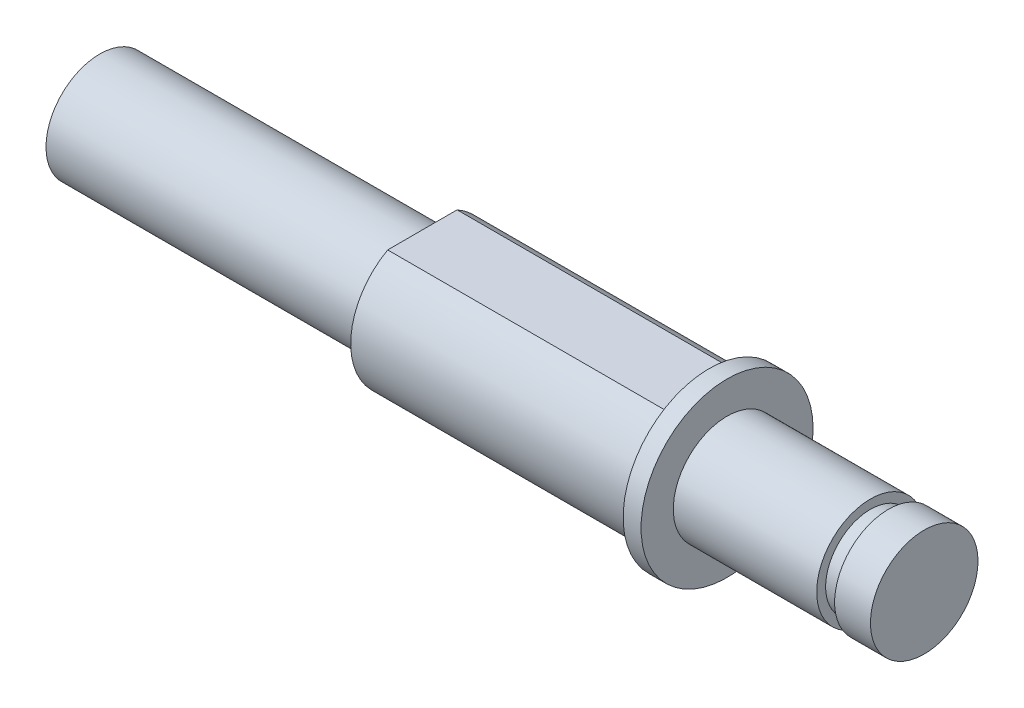
ISO-10303-21;
HEADER;
FILE_DESCRIPTION(('STEP AP214'),'2;1');
FILE_NAME('part.step','',(''),(''),'','','');
FILE_SCHEMA(('AUTOMOTIVE_DESIGN { 1 0 10303 214 1 1 1 1 }'));
ENDSEC;
DATA;
#1=APPLICATION_CONTEXT('core data for automotive mechanical design processes');
#2=APPLICATION_PROTOCOL_DEFINITION('international standard','automotive_design',2000,#1);
#3=PRODUCT_CONTEXT('',#1,'mechanical');
#4=PRODUCT('Part','Part','',(#3));
#5=PRODUCT_RELATED_PRODUCT_CATEGORY('part','',(#4));
#6=PRODUCT_DEFINITION_FORMATION('','',#4);
#7=PRODUCT_DEFINITION_CONTEXT('part definition',#1,'design');
#8=PRODUCT_DEFINITION('design','',#6,#7);
#9=PRODUCT_DEFINITION_SHAPE('','',#8);
#10=(LENGTH_UNIT() NAMED_UNIT(*) SI_UNIT(.MILLI.,.METRE.));
#11=(NAMED_UNIT(*) PLANE_ANGLE_UNIT() SI_UNIT($,.RADIAN.));
#12=(NAMED_UNIT(*) SI_UNIT($,.STERADIAN.) SOLID_ANGLE_UNIT());
#13=UNCERTAINTY_MEASURE_WITH_UNIT(LENGTH_MEASURE(1.E-05),#10,'distance_accuracy_value','');
#14=(GEOMETRIC_REPRESENTATION_CONTEXT(3) GLOBAL_UNCERTAINTY_ASSIGNED_CONTEXT((#13)) GLOBAL_UNIT_ASSIGNED_CONTEXT((#10,
#11,#12)) REPRESENTATION_CONTEXT('',''));
#15=CARTESIAN_POINT('',(0.,0.,0.));
#16=DIRECTION('',(0.,0.,1.));
#17=DIRECTION('',(1.,0.,0.));
#18=AXIS2_PLACEMENT_3D('',#15,#16,#17);
#19=CARTESIAN_POINT('',(23.,0.,0.));
#20=DIRECTION('',(-1.,0.,0.));
#21=DIRECTION('',(0.,0.,1.));
#22=AXIS2_PLACEMENT_3D('',#19,#20,#21);
#23=CYLINDRICAL_SURFACE('',#22,1.5);
#24=CARTESIAN_POINT('',(17.5,0.,0.));
#25=DIRECTION('',(1.,0.,0.));
#26=DIRECTION('',(0.,0.,-1.));
#27=AXIS2_PLACEMENT_3D('',#24,#25,#26);
#28=CIRCLE('',#27,1.5);
#29=CARTESIAN_POINT('',(17.5,0.,-1.5));
#30=VERTEX_POINT('',#29);
#31=EDGE_CURVE('E128',#30,#30,#28,.T.);
#32=ORIENTED_EDGE('',*,*,#31,.T.);
#33=EDGE_LOOP('',(#32));
#34=FACE_BOUND('',#33,.T.);
#35=CARTESIAN_POINT('',(21.5,0.,0.));
#36=DIRECTION('',(1.,0.,0.));
#37=DIRECTION('',(0.,0.,-1.));
#38=AXIS2_PLACEMENT_3D('',#35,#36,#37);
#39=CIRCLE('',#38,1.5);
#40=CARTESIAN_POINT('',(21.5,0.,-1.5));
#41=VERTEX_POINT('',#40);
#42=EDGE_CURVE('E124',#41,#41,#39,.T.);
#43=ORIENTED_EDGE('',*,*,#42,.F.);
#44=EDGE_LOOP('',(#43));
#45=FACE_BOUND('',#44,.T.);
#46=ADVANCED_FACE('F37',(#34,#45),#23,.T.);
#47=CARTESIAN_POINT('',(17.,0.,0.));
#48=DIRECTION('',(-1.,0.,0.));
#49=DIRECTION('',(0.,0.,1.));
#50=AXIS2_PLACEMENT_3D('',#47,#48,#49);
#51=CYLINDRICAL_SURFACE('',#50,2.);
#52=CARTESIAN_POINT('',(9.,0.,0.));
#53=DIRECTION('',(-1.,0.,0.));
#54=DIRECTION('',(0.,0.,1.));
#55=AXIS2_PLACEMENT_3D('',#52,#53,#54);
#56=CIRCLE('',#55,2.);
#57=CARTESIAN_POINT('',(9.,1.75,-0.968245836551854));
#58=VERTEX_POINT('',#57);
#59=CARTESIAN_POINT('',(9.,1.75,0.968245836551854));
#60=VERTEX_POINT('',#59);
#61=EDGE_CURVE('E78',#58,#60,#56,.T.);
#62=ORIENTED_EDGE('',*,*,#61,.F.);
#63=DIRECTION('',(-1.,0.,0.));
#64=VECTOR('',#63,1.);
#65=CARTESIAN_POINT('',(17.,1.75,-0.968245836551854));
#66=LINE('',#65,#64);
#67=CARTESIAN_POINT('',(17.,1.75,-0.968245836551854));
#68=VERTEX_POINT('',#67);
#69=EDGE_CURVE('E74',#68,#58,#66,.T.);
#70=ORIENTED_EDGE('',*,*,#69,.F.);
#71=CARTESIAN_POINT('',(17.,0.,0.));
#72=DIRECTION('',(-1.,0.,0.));
#73=DIRECTION('',(0.,0.,1.));
#74=AXIS2_PLACEMENT_3D('',#71,#72,#73);
#75=CIRCLE('',#74,2.);
#76=CARTESIAN_POINT('',(17.,1.75,0.968245836551854));
#77=VERTEX_POINT('',#76);
#78=EDGE_CURVE('E52',#68,#77,#75,.T.);
#79=ORIENTED_EDGE('',*,*,#78,.T.);
#80=DIRECTION('',(-1.,0.,0.));
#81=VECTOR('',#80,1.);
#82=CARTESIAN_POINT('',(17.,1.75,0.968245836551854));
#83=LINE('',#82,#81);
#84=EDGE_CURVE('E62',#77,#60,#83,.T.);
#85=ORIENTED_EDGE('',*,*,#84,.T.);
#86=EDGE_LOOP('',(#62,#70,#79,#85));
#87=FACE_BOUND('',#86,.T.);
#88=ADVANCED_FACE('F76',(#87),#51,.T.);
#89=CARTESIAN_POINT('',(17.,1.75,0.968245836551854));
#90=DIRECTION('',(0.,1.,0.));
#91=DIRECTION('',(0.,0.,1.));
#92=AXIS2_PLACEMENT_3D('',#89,#90,#91);
#93=PLANE('',#92);
#94=DIRECTION('',(0.,0.,-1.));
#95=VECTOR('',#94,1.);
#96=CARTESIAN_POINT('',(9.,1.75,0.968245836551854));
#97=LINE('',#96,#95);
#98=EDGE_CURVE('E73',#60,#58,#97,.T.);
#99=ORIENTED_EDGE('',*,*,#98,.F.);
#100=ORIENTED_EDGE('',*,*,#84,.F.);
#101=DIRECTION('',(0.,0.,-1.));
#102=VECTOR('',#101,1.);
#103=CARTESIAN_POINT('',(17.,1.75,0.968245836551854));
#104=LINE('',#103,#102);
#105=EDGE_CURVE('E65',#77,#68,#104,.T.);
#106=ORIENTED_EDGE('',*,*,#105,.T.);
#107=ORIENTED_EDGE('',*,*,#69,.T.);
#108=EDGE_LOOP('',(#99,#100,#106,#107));
#109=FACE_BOUND('',#108,.T.);
#110=ADVANCED_FACE('F71',(#109),#93,.T.);
#111=CARTESIAN_POINT('',(9.,0.,0.));
#112=DIRECTION('',(-1.,0.,0.));
#113=DIRECTION('',(0.,0.,1.));
#114=AXIS2_PLACEMENT_3D('',#111,#112,#113);
#115=PLANE('',#114);
#116=CARTESIAN_POINT('',(9.,0.,0.));
#117=DIRECTION('',(-1.,0.,0.));
#118=DIRECTION('',(0.,0.,1.));
#119=AXIS2_PLACEMENT_3D('',#116,#117,#118);
#120=CIRCLE('',#119,1.5);
#121=CARTESIAN_POINT('',(9.,0.,1.5));
#122=VERTEX_POINT('',#121);
#123=EDGE_CURVE('E81',#122,#122,#120,.T.);
#124=ORIENTED_EDGE('',*,*,#123,.F.);
#125=EDGE_LOOP('',(#124));
#126=FACE_BOUND('',#125,.T.);
#127=ORIENTED_EDGE('',*,*,#61,.T.);
#128=ORIENTED_EDGE('',*,*,#98,.T.);
#129=EDGE_LOOP('',(#127,#128));
#130=FACE_BOUND('',#129,.T.);
#131=ADVANCED_FACE('F91',(#126,#130),#115,.T.);
#132=CARTESIAN_POINT('',(0.,0.,0.));
#133=DIRECTION('',(1.,0.,0.));
#134=DIRECTION('',(0.,0.,-1.));
#135=AXIS2_PLACEMENT_3D('',#132,#133,#134);
#136=PLANE('',#135);
#137=CARTESIAN_POINT('',(0.,0.,0.));
#138=DIRECTION('',(1.,0.,0.));
#139=DIRECTION('',(0.,0.,-1.));
#140=AXIS2_PLACEMENT_3D('',#137,#138,#139);
#141=CIRCLE('',#140,1.5);
#142=CARTESIAN_POINT('',(0.,0.,-1.5));
#143=VERTEX_POINT('',#142);
#144=EDGE_CURVE('E41',#143,#143,#141,.T.);
#145=ORIENTED_EDGE('',*,*,#144,.F.);
#146=EDGE_LOOP('',(#145));
#147=FACE_BOUND('',#146,.T.);
#148=ADVANCED_FACE('F89',(#147),#136,.F.);
#149=ORIENTED_EDGE('',*,*,#123,.T.);
#150=EDGE_LOOP('',(#149));
#151=FACE_BOUND('',#150,.T.);
#152=ORIENTED_EDGE('',*,*,#144,.T.);
#153=EDGE_LOOP('',(#152));
#154=FACE_BOUND('',#153,.T.);
#155=ADVANCED_FACE('F39',(#151,#154),#23,.T.);
#156=CARTESIAN_POINT('',(17.5,0.,0.));
#157=DIRECTION('',(1.,0.,0.));
#158=DIRECTION('',(0.,0.,-1.));
#159=AXIS2_PLACEMENT_3D('',#156,#157,#158);
#160=PLANE('',#159);
#161=CARTESIAN_POINT('',(17.5,0.,0.));
#162=DIRECTION('',(1.,0.,0.));
#163=DIRECTION('',(0.,0.,-1.));
#164=AXIS2_PLACEMENT_3D('',#161,#162,#163);
#165=CIRCLE('',#164,2.4);
#166=CARTESIAN_POINT('',(17.5,0.,-2.4));
#167=VERTEX_POINT('',#166);
#168=EDGE_CURVE('E137',#167,#167,#165,.T.);
#169=ORIENTED_EDGE('',*,*,#168,.T.);
#170=EDGE_LOOP('',(#169));
#171=FACE_BOUND('',#170,.T.);
#172=ORIENTED_EDGE('',*,*,#31,.F.);
#173=EDGE_LOOP('',(#172));
#174=FACE_BOUND('',#173,.T.);
#175=ADVANCED_FACE('F96',(#171,#174),#160,.T.);
#176=CARTESIAN_POINT('',(17.,0.,0.));
#177=DIRECTION('',(1.,0.,0.));
#178=DIRECTION('',(0.,0.,-1.));
#179=AXIS2_PLACEMENT_3D('',#176,#177,#178);
#180=PLANE('',#179);
#181=ORIENTED_EDGE('',*,*,#78,.F.);
#182=ORIENTED_EDGE('',*,*,#105,.F.);
#183=EDGE_LOOP('',(#181,#182));
#184=FACE_BOUND('',#183,.T.);
#185=CARTESIAN_POINT('',(17.,0.,0.));
#186=DIRECTION('',(1.,0.,0.));
#187=DIRECTION('',(0.,0.,-1.));
#188=AXIS2_PLACEMENT_3D('',#185,#186,#187);
#189=CIRCLE('',#188,2.4);
#190=CARTESIAN_POINT('',(17.,0.,-2.4));
#191=VERTEX_POINT('',#190);
#192=EDGE_CURVE('E136',#191,#191,#189,.T.);
#193=ORIENTED_EDGE('',*,*,#192,.F.);
#194=EDGE_LOOP('',(#193));
#195=FACE_BOUND('',#194,.T.);
#196=ADVANCED_FACE('F66',(#184,#195),#180,.F.);
#197=CARTESIAN_POINT('',(17.5,0.,0.));
#198=DIRECTION('',(-1.,0.,0.));
#199=DIRECTION('',(0.,0.,1.));
#200=AXIS2_PLACEMENT_3D('',#197,#198,#199);
#201=CYLINDRICAL_SURFACE('',#200,2.4);
#202=ORIENTED_EDGE('',*,*,#168,.F.);
#203=EDGE_LOOP('',(#202));
#204=FACE_BOUND('',#203,.T.);
#205=ORIENTED_EDGE('',*,*,#192,.T.);
#206=EDGE_LOOP('',(#205));
#207=FACE_BOUND('',#206,.T.);
#208=ADVANCED_FACE('F142',(#204,#207),#201,.T.);
#209=CARTESIAN_POINT('',(21.5,0.,0.));
#210=DIRECTION('',(1.,0.,0.));
#211=DIRECTION('',(0.,0.,-1.));
#212=AXIS2_PLACEMENT_3D('',#209,#210,#211);
#213=PLANE('',#212);
#214=CARTESIAN_POINT('',(21.5,0.,0.));
#215=DIRECTION('',(1.,0.,0.));
#216=DIRECTION('',(0.,0.,-1.));
#217=AXIS2_PLACEMENT_3D('',#214,#215,#216);
#218=CIRCLE('',#217,1.25);
#219=CARTESIAN_POINT('',(21.5,0.,-1.25));
#220=VERTEX_POINT('',#219);
#221=EDGE_CURVE('E125',#220,#220,#218,.T.);
#222=ORIENTED_EDGE('',*,*,#221,.F.);
#223=EDGE_LOOP('',(#222));
#224=FACE_BOUND('',#223,.T.);
#225=ORIENTED_EDGE('',*,*,#42,.T.);
#226=EDGE_LOOP('',(#225));
#227=FACE_BOUND('',#226,.T.);
#228=ADVANCED_FACE('F149',(#224,#227),#213,.T.);
#229=CARTESIAN_POINT('',(22.,0.,0.));
#230=DIRECTION('',(1.,0.,0.));
#231=DIRECTION('',(0.,0.,-1.));
#232=AXIS2_PLACEMENT_3D('',#229,#230,#231);
#233=PLANE('',#232);
#234=CARTESIAN_POINT('',(22.,0.,0.));
#235=DIRECTION('',(1.,0.,0.));
#236=DIRECTION('',(0.,0.,-1.));
#237=AXIS2_PLACEMENT_3D('',#234,#235,#236);
#238=CIRCLE('',#237,1.25);
#239=CARTESIAN_POINT('',(22.,0.,-1.25));
#240=VERTEX_POINT('',#239);
#241=EDGE_CURVE('E131',#240,#240,#238,.T.);
#242=ORIENTED_EDGE('',*,*,#241,.T.);
#243=EDGE_LOOP('',(#242));
#244=FACE_BOUND('',#243,.T.);
#245=CARTESIAN_POINT('',(22.,0.,0.));
#246=DIRECTION('',(1.,0.,0.));
#247=DIRECTION('',(0.,0.,-1.));
#248=AXIS2_PLACEMENT_3D('',#245,#246,#247);
#249=CIRCLE('',#248,1.5);
#250=CARTESIAN_POINT('',(22.,0.,-1.5));
#251=VERTEX_POINT('',#250);
#252=EDGE_CURVE('E121',#251,#251,#249,.T.);
#253=ORIENTED_EDGE('',*,*,#252,.F.);
#254=EDGE_LOOP('',(#253));
#255=FACE_BOUND('',#254,.T.);
#256=ADVANCED_FACE('F201',(#244,#255),#233,.F.);
#257=CARTESIAN_POINT('',(21.5,0.,0.));
#258=DIRECTION('',(1.,0.,0.));
#259=DIRECTION('',(0.,0.,-1.));
#260=AXIS2_PLACEMENT_3D('',#257,#258,#259);
#261=CYLINDRICAL_SURFACE('',#260,1.25);
#262=ORIENTED_EDGE('',*,*,#221,.T.);
#263=EDGE_LOOP('',(#262));
#264=FACE_BOUND('',#263,.T.);
#265=ORIENTED_EDGE('',*,*,#241,.F.);
#266=EDGE_LOOP('',(#265));
#267=FACE_BOUND('',#266,.T.);
#268=ADVANCED_FACE('F116',(#264,#267),#261,.T.);
#269=CARTESIAN_POINT('',(23.,0.,0.));
#270=DIRECTION('',(1.,0.,0.));
#271=DIRECTION('',(0.,0.,-1.));
#272=AXIS2_PLACEMENT_3D('',#269,#270,#271);
#273=PLANE('',#272);
#274=CARTESIAN_POINT('',(23.,0.,0.));
#275=DIRECTION('',(1.,0.,0.));
#276=DIRECTION('',(0.,0.,-1.));
#277=AXIS2_PLACEMENT_3D('',#274,#275,#276);
#278=CIRCLE('',#277,1.5);
#279=CARTESIAN_POINT('',(23.,0.,-1.5));
#280=VERTEX_POINT('',#279);
#281=EDGE_CURVE('E11',#280,#280,#278,.T.);
#282=ORIENTED_EDGE('',*,*,#281,.T.);
#283=EDGE_LOOP('',(#282));
#284=FACE_BOUND('',#283,.T.);
#285=ADVANCED_FACE('F111',(#284),#273,.T.);
#286=ORIENTED_EDGE('',*,*,#252,.T.);
#287=EDGE_LOOP('',(#286));
#288=FACE_BOUND('',#287,.T.);
#289=ORIENTED_EDGE('',*,*,#281,.F.);
#290=EDGE_LOOP('',(#289));
#291=FACE_BOUND('',#290,.T.);
#292=ADVANCED_FACE('F98',(#288,#291),#23,.T.);
#293=CLOSED_SHELL('',(#46,#88,#110,#131,#148,#155,#175,#196,#208,#228,#256,#268,#285,#292));
#294=MANIFOLD_SOLID_BREP('B2',#293);
#295=ADVANCED_BREP_SHAPE_REPRESENTATION('',(#18,#294),#14);
#296=SHAPE_DEFINITION_REPRESENTATION(#9,#295);
ENDSEC;
END-ISO-10303-21;
